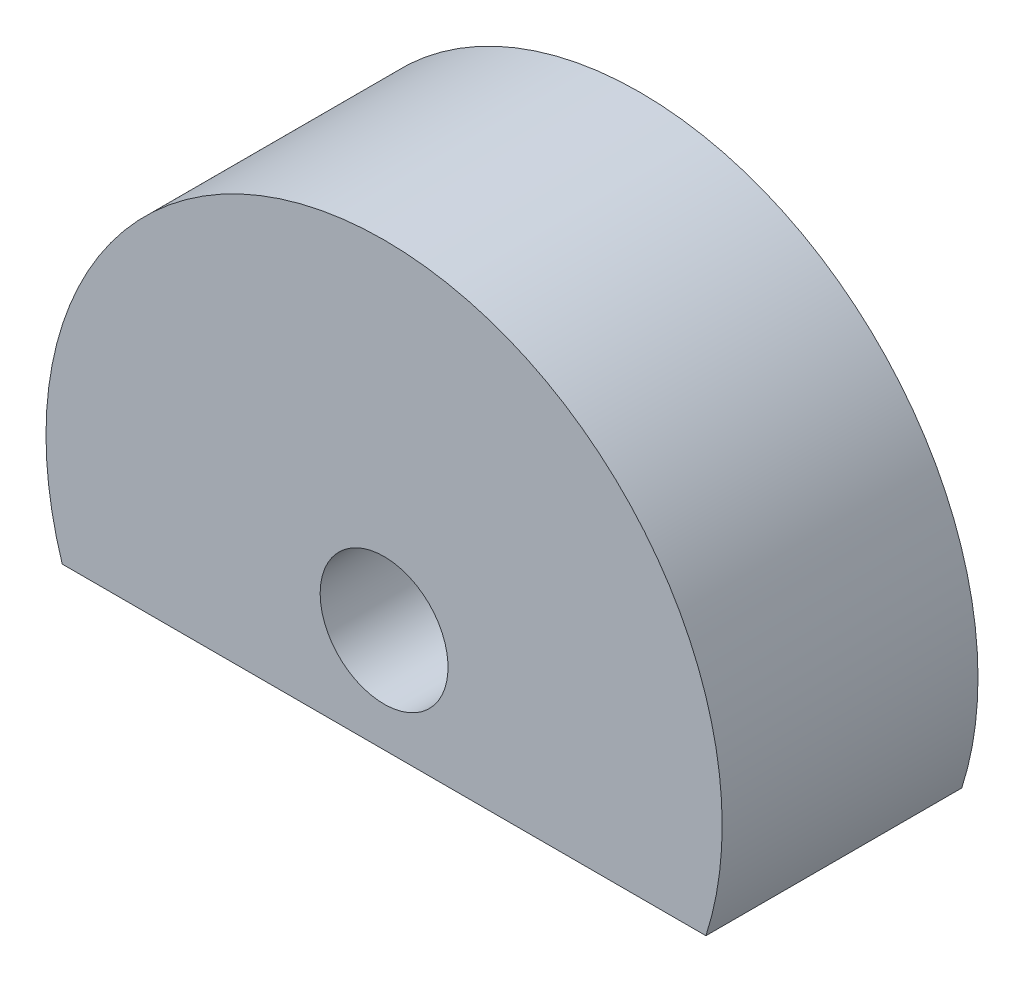
ISO-10303-21;
HEADER;
FILE_DESCRIPTION(('STEP AP214'),'2;1');
FILE_NAME('part.step','',(''),(''),'','','');
FILE_SCHEMA(('AUTOMOTIVE_DESIGN { 1 0 10303 214 1 1 1 1 }'));
ENDSEC;
DATA;
#1=APPLICATION_CONTEXT('core data for automotive mechanical design processes');
#2=APPLICATION_PROTOCOL_DEFINITION('international standard','automotive_design',2000,#1);
#3=PRODUCT_CONTEXT('',#1,'mechanical');
#4=PRODUCT('Part','Part','',(#3));
#5=PRODUCT_RELATED_PRODUCT_CATEGORY('part','',(#4));
#6=PRODUCT_DEFINITION_FORMATION('','',#4);
#7=PRODUCT_DEFINITION_CONTEXT('part definition',#1,'design');
#8=PRODUCT_DEFINITION('design','',#6,#7);
#9=PRODUCT_DEFINITION_SHAPE('','',#8);
#10=(LENGTH_UNIT() NAMED_UNIT(*) SI_UNIT(.MILLI.,.METRE.));
#11=(NAMED_UNIT(*) PLANE_ANGLE_UNIT() SI_UNIT($,.RADIAN.));
#12=(NAMED_UNIT(*) SI_UNIT($,.STERADIAN.) SOLID_ANGLE_UNIT());
#13=UNCERTAINTY_MEASURE_WITH_UNIT(LENGTH_MEASURE(1.E-05),#10,'distance_accuracy_value','');
#14=(GEOMETRIC_REPRESENTATION_CONTEXT(3) GLOBAL_UNCERTAINTY_ASSIGNED_CONTEXT((#13)) GLOBAL_UNIT_ASSIGNED_CONTEXT((#10,
#11,#12)) REPRESENTATION_CONTEXT('',''));
#15=CARTESIAN_POINT('',(0.,0.,0.));
#16=DIRECTION('',(0.,0.,1.));
#17=DIRECTION('',(1.,0.,0.));
#18=AXIS2_PLACEMENT_3D('',#15,#16,#17);
#19=CARTESIAN_POINT('',(-72.6000000000004,-142.329319835257,50.8341849426017));
#20=DIRECTION('',(0.,0.,-1.));
#21=DIRECTION('',(-1.,0.,0.));
#22=AXIS2_PLACEMENT_3D('',#19,#20,#21);
#23=CYLINDRICAL_SURFACE('',#22,10.0706801647427);
#24=CARTESIAN_POINT('',(-72.6000000000004,-142.329319835257,14.7299999999999));
#25=DIRECTION('',(0.,0.,1.));
#26=DIRECTION('',(1.,0.,0.));
#27=AXIS2_PLACEMENT_3D('',#24,#25,#26);
#28=CIRCLE('',#27,10.0706801647427);
#29=CARTESIAN_POINT('',(-63.0136984763962,-145.415,14.7299999999999));
#30=VERTEX_POINT('',#29);
#31=CARTESIAN_POINT('',(-82.1863015236046,-145.415,14.7299999999999));
#32=VERTEX_POINT('',#31);
#33=EDGE_CURVE('E64',#30,#32,#28,.T.);
#34=ORIENTED_EDGE('',*,*,#33,.T.);
#35=DIRECTION('',(0.,0.,1.));
#36=VECTOR('',#35,1.);
#37=CARTESIAN_POINT('',(-82.1863015236046,-145.415,14.7299999999999));
#38=LINE('',#37,#36);
#39=CARTESIAN_POINT('',(-82.1863015236046,-145.415,22.3499999999999));
#40=VERTEX_POINT('',#39);
#41=EDGE_CURVE('E71',#32,#40,#38,.T.);
#42=ORIENTED_EDGE('',*,*,#41,.T.);
#43=CARTESIAN_POINT('',(-72.6000000000004,-142.329319835257,22.35));
#44=DIRECTION('',(0.,0.,-1.));
#45=DIRECTION('',(0.,1.,0.));
#46=AXIS2_PLACEMENT_3D('',#43,#44,#45);
#47=CIRCLE('',#46,10.0706801647427);
#48=CARTESIAN_POINT('',(-63.0136984763962,-145.415,22.35));
#49=VERTEX_POINT('',#48);
#50=EDGE_CURVE('E49',#40,#49,#47,.T.);
#51=ORIENTED_EDGE('',*,*,#50,.T.);
#52=DIRECTION('',(0.,0.,1.));
#53=VECTOR('',#52,1.);
#54=CARTESIAN_POINT('',(-63.0136984763962,-145.415,14.7299999999999));
#55=LINE('',#54,#53);
#56=EDGE_CURVE('E56',#30,#49,#55,.T.);
#57=ORIENTED_EDGE('',*,*,#56,.F.);
#58=EDGE_LOOP('',(#34,#42,#51,#57));
#59=FACE_BOUND('',#58,.T.);
#60=ADVANCED_FACE('F41',(#59),#23,.T.);
#61=CARTESIAN_POINT('',(-72.6000000000004,-142.329319835257,50.8341849426017));
#62=DIRECTION('',(0.,0.,-1.));
#63=DIRECTION('',(-1.,0.,0.));
#64=AXIS2_PLACEMENT_3D('',#61,#62,#63);
#65=CYLINDRICAL_SURFACE('',#64,1.905);
#66=CARTESIAN_POINT('',(-72.6000000000004,-142.329319835257,14.7299999999999));
#67=DIRECTION('',(0.,0.,1.));
#68=DIRECTION('',(1.,0.,0.));
#69=AXIS2_PLACEMENT_3D('',#66,#67,#68);
#70=CIRCLE('',#69,1.905);
#71=CARTESIAN_POINT('',(-74.5050000000004,-142.329319835257,14.7299999999999));
#72=VERTEX_POINT('',#71);
#73=EDGE_CURVE('E73',#72,#72,#70,.T.);
#74=CARTESIAN_POINT('',(-72.6000000000004,-142.329319835257,22.35));
#75=DIRECTION('',(0.,0.,-1.));
#76=DIRECTION('',(0.,1.,0.));
#77=AXIS2_PLACEMENT_3D('',#74,#75,#76);
#78=CIRCLE('',#77,1.905);
#79=CARTESIAN_POINT('',(-74.5050000000004,-142.329319835257,22.35));
#80=VERTEX_POINT('',#79);
#81=EDGE_CURVE('E11',#80,#80,#78,.T.);
#82=CARTESIAN_POINT('',(-74.5050000000004,-142.329319835257,14.7299999999999));
#83=CARTESIAN_POINT('',(-74.5050000000004,-142.329319835257,14.8093749999999));
#84=CARTESIAN_POINT('',(-74.5050000000004,-142.329319835257,14.8887499999999));
#85=CARTESIAN_POINT('',(-74.5050000000004,-142.329319835257,15.0474999999999));
#86=CARTESIAN_POINT('',(-74.5050000000004,-142.329319835257,15.1268749999999));
#87=CARTESIAN_POINT('',(-74.5050000000004,-142.329319835257,15.2856249999999));
#88=CARTESIAN_POINT('',(-74.5050000000004,-142.329319835257,15.3649999999999));
#89=CARTESIAN_POINT('',(-74.5050000000004,-142.329319835257,15.5237499999999));
#90=CARTESIAN_POINT('',(-74.5050000000004,-142.329319835257,15.6031249999999));
#91=CARTESIAN_POINT('',(-74.5050000000004,-142.329319835257,15.7618749999999));
#92=CARTESIAN_POINT('',(-74.5050000000004,-142.329319835257,15.8412499999999));
#93=CARTESIAN_POINT('',(-74.5050000000004,-142.329319835257,15.9999999999999));
#94=CARTESIAN_POINT('',(-74.5050000000004,-142.329319835257,16.0793749999999));
#95=CARTESIAN_POINT('',(-74.5050000000004,-142.329319835257,16.2381249999999));
#96=CARTESIAN_POINT('',(-74.5050000000004,-142.329319835257,16.3174999999999));
#97=CARTESIAN_POINT('',(-74.5050000000004,-142.329319835257,16.4762499999999));
#98=CARTESIAN_POINT('',(-74.5050000000004,-142.329319835257,16.5556249999999));
#99=CARTESIAN_POINT('',(-74.5050000000004,-142.329319835257,16.7143749999999));
#100=CARTESIAN_POINT('',(-74.5050000000004,-142.329319835257,16.7937499999999));
#101=CARTESIAN_POINT('',(-74.5050000000004,-142.329319835257,16.9524999999999));
#102=CARTESIAN_POINT('',(-74.5050000000004,-142.329319835257,17.0318749999999));
#103=CARTESIAN_POINT('',(-74.5050000000004,-142.329319835257,17.1906249999999));
#104=CARTESIAN_POINT('',(-74.5050000000004,-142.329319835257,17.2699999999999));
#105=CARTESIAN_POINT('',(-74.5050000000004,-142.329319835257,17.4287499999999));
#106=CARTESIAN_POINT('',(-74.5050000000004,-142.329319835257,17.5081249999999));
#107=CARTESIAN_POINT('',(-74.5050000000004,-142.329319835257,17.6668749999999));
#108=CARTESIAN_POINT('',(-74.5050000000004,-142.329319835257,17.7462499999999));
#109=CARTESIAN_POINT('',(-74.5050000000004,-142.329319835257,17.9049999999999));
#110=CARTESIAN_POINT('',(-74.5050000000004,-142.329319835257,17.9843749999999));
#111=CARTESIAN_POINT('',(-74.5050000000004,-142.329319835257,18.1431249999999));
#112=CARTESIAN_POINT('',(-74.5050000000004,-142.329319835257,18.2224999999999));
#113=CARTESIAN_POINT('',(-74.5050000000004,-142.329319835257,18.3812499999999));
#114=CARTESIAN_POINT('',(-74.5050000000004,-142.329319835257,18.4606249999999));
#115=CARTESIAN_POINT('',(-74.5050000000004,-142.329319835257,18.6193749999999));
#116=CARTESIAN_POINT('',(-74.5050000000004,-142.329319835257,18.6987499999999));
#117=CARTESIAN_POINT('',(-74.5050000000004,-142.329319835257,18.8574999999999));
#118=CARTESIAN_POINT('',(-74.5050000000004,-142.329319835257,18.9368749999999));
#119=CARTESIAN_POINT('',(-74.5050000000004,-142.329319835257,19.0956249999999));
#120=CARTESIAN_POINT('',(-74.5050000000004,-142.329319835257,19.1749999999999));
#121=CARTESIAN_POINT('',(-74.5050000000004,-142.329319835257,19.3337499999999));
#122=CARTESIAN_POINT('',(-74.5050000000004,-142.329319835257,19.4131249999999));
#123=CARTESIAN_POINT('',(-74.5050000000004,-142.329319835257,19.5718749999999));
#124=CARTESIAN_POINT('',(-74.5050000000004,-142.329319835257,19.6512499999999));
#125=CARTESIAN_POINT('',(-74.5050000000004,-142.329319835257,19.8099999999999));
#126=CARTESIAN_POINT('',(-74.5050000000004,-142.329319835257,19.8893749999999));
#127=CARTESIAN_POINT('',(-74.5050000000004,-142.329319835257,20.0481249999999));
#128=CARTESIAN_POINT('',(-74.5050000000004,-142.329319835257,20.1274999999999));
#129=CARTESIAN_POINT('',(-74.5050000000004,-142.329319835257,20.2862499999999));
#130=CARTESIAN_POINT('',(-74.5050000000004,-142.329319835257,20.3656249999999));
#131=CARTESIAN_POINT('',(-74.5050000000004,-142.329319835257,20.5243749999999));
#132=CARTESIAN_POINT('',(-74.5050000000004,-142.329319835257,20.6037499999999));
#133=CARTESIAN_POINT('',(-74.5050000000004,-142.329319835257,20.7624999999999));
#134=CARTESIAN_POINT('',(-74.5050000000004,-142.329319835257,20.8418749999999));
#135=CARTESIAN_POINT('',(-74.5050000000004,-142.329319835257,21.0006249999999));
#136=CARTESIAN_POINT('',(-74.5050000000004,-142.329319835257,21.0799999999999));
#137=CARTESIAN_POINT('',(-74.5050000000004,-142.329319835257,21.2387499999999));
#138=CARTESIAN_POINT('',(-74.5050000000004,-142.329319835257,21.3181249999999));
#139=CARTESIAN_POINT('',(-74.5050000000004,-142.329319835257,21.4768749999999));
#140=CARTESIAN_POINT('',(-74.5050000000004,-142.329319835257,21.5562499999999));
#141=CARTESIAN_POINT('',(-74.5050000000004,-142.329319835257,21.715));
#142=CARTESIAN_POINT('',(-74.5050000000004,-142.329319835257,21.794375));
#143=CARTESIAN_POINT('',(-74.5050000000004,-142.329319835257,21.953125));
#144=CARTESIAN_POINT('',(-74.5050000000004,-142.329319835257,22.0325));
#145=CARTESIAN_POINT('',(-74.5050000000004,-142.329319835257,22.19125));
#146=CARTESIAN_POINT('',(-74.5050000000004,-142.329319835257,22.270625));
#147=CARTESIAN_POINT('',(-74.5050000000004,-142.329319835257,22.35));
#148=B_SPLINE_CURVE_WITH_KNOTS('',3,(#82,#83,#84,#85,#86,#87,#88,#89,#90,#91,#92,#93,#94,#95,
#96,#97,#98,#99,#100,#101,#102,#103,#104,#105,#106,#107,#108,#109,#110,#111,#112,#113,#114,#115,
#116,#117,#118,#119,#120,#121,#122,#123,#124,#125,#126,#127,#128,#129,#130,#131,#132,#133,#134,
#135,#136,#137,#138,#139,#140,#141,#142,#143,#144,#145,#146,#147),.UNSPECIFIED.,.F.,.F.,(4,2,2,
2,2,2,2,2,2,2,2,2,2,2,2,2,2,2,2,2,2,2,2,2,2,2,2,2,2,2,2,2,4),(0.,0.238125000000006,
0.476250000000004,0.71437500000001,0.952500000000009,1.19062500000001,1.42875000000002,
1.66687500000002,1.90500000000002,2.14312500000003,2.38125000000003,2.61937500000003,
2.85750000000004,3.09562500000004,3.33375000000005,3.57187500000004,3.81000000000005,
4.04812500000005,4.28625000000005,4.52437500000006,4.76250000000006,5.00062500000006,
5.23875000000007,5.47687500000007,5.71500000000007,5.95312500000008,6.19125000000008,
6.42937500000008,6.66750000000009,6.90562500000009,7.14375000000009,7.3818750000001,
7.6200000000001),.UNSPECIFIED.);
#149=EDGE_CURVE('BSEAM88',#72,#80,#148,.T.);
#150=ORIENTED_EDGE('',*,*,#73,.F.);
#151=ORIENTED_EDGE('',*,*,#81,.F.);
#152=ORIENTED_EDGE('',*,*,#149,.T.);
#153=ORIENTED_EDGE('',*,*,#149,.F.);
#154=EDGE_LOOP('',(#150,#152,#151,#153));
#155=FACE_BOUND('',#154,.T.);
#156=ADVANCED_FACE('F88',(#155),#65,.F.);
#157=CARTESIAN_POINT('',(-71.9801430776759,144.424341268356,22.3499999999996));
#158=DIRECTION('',(0.,0.,-1.));
#159=DIRECTION('',(0.0826475896433208,0.996578835780767,0.));
#160=AXIS2_PLACEMENT_3D('',#157,#158,#159);
#161=PLANE('',#160);
#162=ORIENTED_EDGE('',*,*,#81,.T.);
#163=EDGE_LOOP('',(#162));
#164=FACE_BOUND('',#163,.T.);
#165=ORIENTED_EDGE('',*,*,#50,.F.);
#166=DIRECTION('',(-1.,0.,0.));
#167=VECTOR('',#166,1.);
#168=CARTESIAN_POINT('',(-63.0136984763962,-145.415,22.3499999999999));
#169=LINE('',#168,#167);
#170=EDGE_CURVE('E77',#49,#40,#169,.T.);
#171=ORIENTED_EDGE('',*,*,#170,.F.);
#172=EDGE_LOOP('',(#165,#171));
#173=FACE_BOUND('',#172,.T.);
#174=ADVANCED_FACE('F43',(#164,#173),#161,.F.);
#175=CARTESIAN_POINT('',(-63.0136984763962,-145.415,14.7299999999999));
#176=DIRECTION('',(0.,1.,0.));
#177=DIRECTION('',(-1.,0.,0.));
#178=AXIS2_PLACEMENT_3D('',#175,#176,#177);
#179=PLANE('',#178);
#180=ORIENTED_EDGE('',*,*,#170,.T.);
#181=ORIENTED_EDGE('',*,*,#41,.F.);
#182=DIRECTION('',(-1.,0.,0.));
#183=VECTOR('',#182,1.);
#184=CARTESIAN_POINT('',(-63.0136984763962,-145.415,14.7299999999999));
#185=LINE('',#184,#183);
#186=EDGE_CURVE('E75',#30,#32,#185,.T.);
#187=ORIENTED_EDGE('',*,*,#186,.F.);
#188=ORIENTED_EDGE('',*,*,#56,.T.);
#189=EDGE_LOOP('',(#180,#181,#187,#188));
#190=FACE_BOUND('',#189,.T.);
#191=ADVANCED_FACE('F79',(#190),#179,.F.);
#192=CARTESIAN_POINT('',(-82.6706801647431,-132.258639670514,14.7299999999999));
#193=DIRECTION('',(0.,0.,1.));
#194=DIRECTION('',(1.,0.,0.));
#195=AXIS2_PLACEMENT_3D('',#192,#193,#194);
#196=PLANE('',#195);
#197=ORIENTED_EDGE('',*,*,#73,.T.);
#198=EDGE_LOOP('',(#197));
#199=FACE_BOUND('',#198,.T.);
#200=ORIENTED_EDGE('',*,*,#33,.F.);
#201=ORIENTED_EDGE('',*,*,#186,.T.);
#202=EDGE_LOOP('',(#200,#201));
#203=FACE_BOUND('',#202,.T.);
#204=ADVANCED_FACE('F76',(#199,#203),#196,.F.);
#205=CLOSED_SHELL('',(#60,#156,#174,#191,#204));
#206=MANIFOLD_SOLID_BREP('B2',#205);
#207=ADVANCED_BREP_SHAPE_REPRESENTATION('',(#18,#206),#14);
#208=SHAPE_DEFINITION_REPRESENTATION(#9,#207);
ENDSEC;
END-ISO-10303-21;
